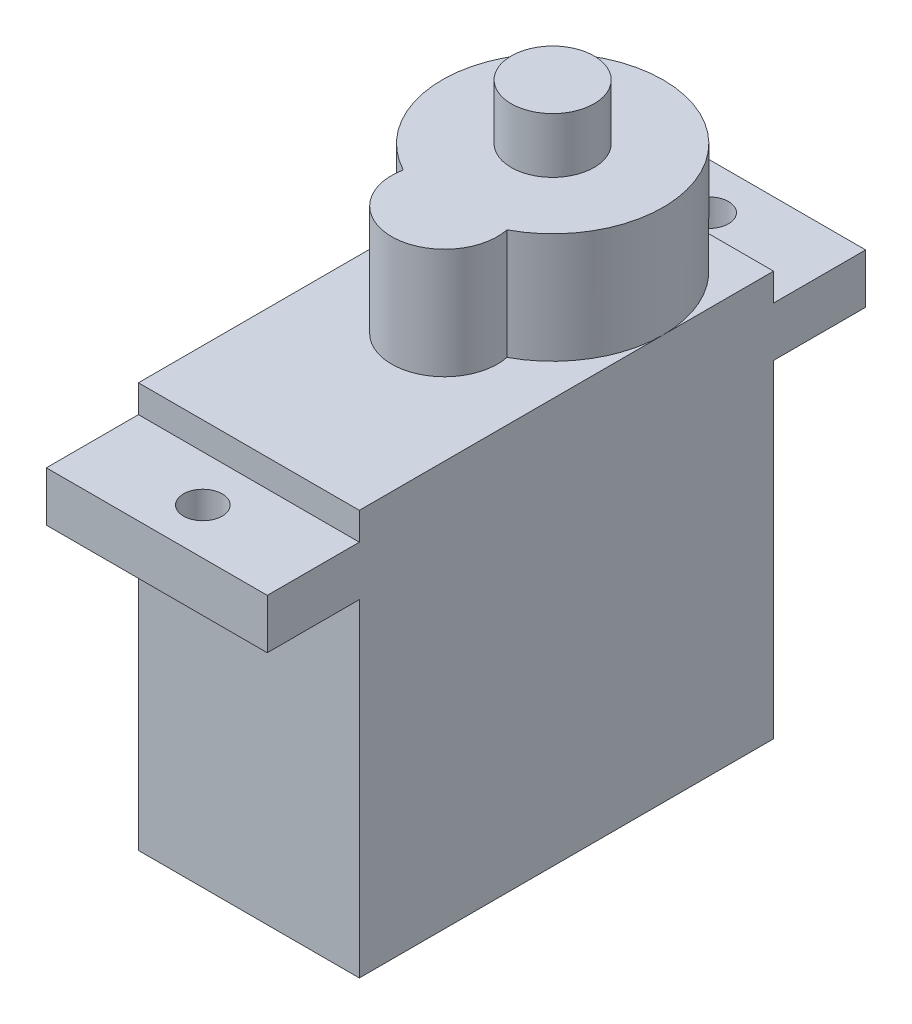
ISO-10303-21;
HEADER;
FILE_DESCRIPTION(('STEP AP214'),'2;1');
FILE_NAME('part.step','',(''),(''),'','','');
FILE_SCHEMA(('AUTOMOTIVE_DESIGN { 1 0 10303 214 1 1 1 1 }'));
ENDSEC;
DATA;
#1=APPLICATION_CONTEXT('core data for automotive mechanical design processes');
#2=APPLICATION_PROTOCOL_DEFINITION('international standard','automotive_design',2000,#1);
#3=PRODUCT_CONTEXT('',#1,'mechanical');
#4=PRODUCT('Part','Part','',(#3));
#5=PRODUCT_RELATED_PRODUCT_CATEGORY('part','',(#4));
#6=PRODUCT_DEFINITION_FORMATION('','',#4);
#7=PRODUCT_DEFINITION_CONTEXT('part definition',#1,'design');
#8=PRODUCT_DEFINITION('design','',#6,#7);
#9=PRODUCT_DEFINITION_SHAPE('','',#8);
#10=(LENGTH_UNIT() NAMED_UNIT(*) SI_UNIT(.MILLI.,.METRE.));
#11=(NAMED_UNIT(*) PLANE_ANGLE_UNIT() SI_UNIT($,.RADIAN.));
#12=(NAMED_UNIT(*) SI_UNIT($,.STERADIAN.) SOLID_ANGLE_UNIT());
#13=UNCERTAINTY_MEASURE_WITH_UNIT(LENGTH_MEASURE(1.E-05),#10,'distance_accuracy_value','');
#14=(GEOMETRIC_REPRESENTATION_CONTEXT(3) GLOBAL_UNCERTAINTY_ASSIGNED_CONTEXT((#13)) GLOBAL_UNIT_ASSIGNED_CONTEXT((#10,
#11,#12)) REPRESENTATION_CONTEXT('',''));
#15=CARTESIAN_POINT('',(0.,0.,0.));
#16=DIRECTION('',(0.,0.,1.));
#17=DIRECTION('',(1.,0.,0.));
#18=AXIS2_PLACEMENT_3D('',#15,#16,#17);
#19=CARTESIAN_POINT('',(12.,17.,-11.25));
#20=DIRECTION('',(0.,-1.,0.));
#21=DIRECTION('',(0.,0.,-1.));
#22=AXIS2_PLACEMENT_3D('',#19,#20,#21);
#23=PLANE('',#22);
#24=CARTESIAN_POINT('',(6.,17.,-5.25));
#25=DIRECTION('',(0.,1.,0.));
#26=DIRECTION('',(0.,0.,1.));
#27=AXIS2_PLACEMENT_3D('',#24,#25,#26);
#28=CIRCLE('',#27,2.25);
#29=CARTESIAN_POINT('',(6.,17.,-3.));
#30=VERTEX_POINT('',#29);
#31=EDGE_CURVE('E12',#30,#30,#28,.T.);
#32=ORIENTED_EDGE('',*,*,#31,.F.);
#33=EDGE_LOOP('',(#32));
#34=FACE_BOUND('',#33,.T.);
#35=CARTESIAN_POINT('',(6.,17.,-5.25));
#36=DIRECTION('',(0.,1.,0.));
#37=DIRECTION('',(0.,0.,1.));
#38=AXIS2_PLACEMENT_3D('',#35,#36,#37);
#39=CIRCLE('',#38,6.);
#40=CARTESIAN_POINT('',(8.81647806037152,17.,0.0478723404255359));
#41=VERTEX_POINT('',#40);
#42=CARTESIAN_POINT('',(3.18352193962849,17.,0.0478723404255359));
#43=VERTEX_POINT('',#42);
#44=EDGE_CURVE('E262',#41,#43,#39,.T.);
#45=ORIENTED_EDGE('',*,*,#44,.T.);
#46=CARTESIAN_POINT('',(6.,17.,0.625000000000002));
#47=DIRECTION('',(0.,1.,0.));
#48=DIRECTION('',(0.,0.,1.));
#49=AXIS2_PLACEMENT_3D('',#46,#47,#48);
#50=CIRCLE('',#49,2.875);
#51=EDGE_CURVE('E266',#43,#41,#50,.T.);
#52=ORIENTED_EDGE('',*,*,#51,.T.);
#53=EDGE_LOOP('',(#45,#52));
#54=FACE_BOUND('',#53,.T.);
#55=ADVANCED_FACE('F57',(#34,#54),#23,.F.);
#56=CARTESIAN_POINT('',(0.,0.,0.));
#57=DIRECTION('',(1.,0.,0.));
#58=DIRECTION('',(0.,0.,-1.));
#59=AXIS2_PLACEMENT_3D('',#56,#57,#58);
#60=PLANE('',#59);
#61=DIRECTION('',(0.,0.,-1.));
#62=VECTOR('',#61,1.);
#63=CARTESIAN_POINT('',(0.,11.,11.25));
#64=LINE('',#63,#62);
#65=CARTESIAN_POINT('',(0.,11.,11.25));
#66=VERTEX_POINT('',#65);
#67=CARTESIAN_POINT('',(0.,11.,-5.25));
#68=VERTEX_POINT('',#67);
#69=EDGE_CURVE('E207',#66,#68,#64,.T.);
#70=ORIENTED_EDGE('',*,*,#69,.T.);
#71=DIRECTION('',(0.,0.,1.));
#72=VECTOR('',#71,1.);
#73=CARTESIAN_POINT('',(0.,11.,0.));
#74=LINE('',#73,#72);
#75=CARTESIAN_POINT('',(0.,11.,-11.25));
#76=VERTEX_POINT('',#75);
#77=EDGE_CURVE('E222',#76,#68,#74,.T.);
#78=ORIENTED_EDGE('',*,*,#77,.F.);
#79=DIRECTION('',(0.,1.,0.));
#80=VECTOR('',#79,1.);
#81=CARTESIAN_POINT('',(0.,-11.,-11.25));
#82=LINE('',#81,#80);
#83=CARTESIAN_POINT('',(0.,9.5,-11.25));
#84=VERTEX_POINT('',#83);
#85=EDGE_CURVE('E237',#84,#76,#82,.T.);
#86=ORIENTED_EDGE('',*,*,#85,.F.);
#87=DIRECTION('',(0.,0.,-1.));
#88=VECTOR('',#87,1.);
#89=CARTESIAN_POINT('',(0.,9.5,-11.25));
#90=LINE('',#89,#88);
#91=CARTESIAN_POINT('',(0.,9.5,-16.25));
#92=VERTEX_POINT('',#91);
#93=EDGE_CURVE('E213',#84,#92,#90,.T.);
#94=ORIENTED_EDGE('',*,*,#93,.T.);
#95=DIRECTION('',(0.,-1.,0.));
#96=VECTOR('',#95,1.);
#97=CARTESIAN_POINT('',(0.,9.5,-16.25));
#98=LINE('',#97,#96);
#99=CARTESIAN_POINT('',(0.,6.8,-16.25));
#100=VERTEX_POINT('',#99);
#101=EDGE_CURVE('E221',#92,#100,#98,.T.);
#102=ORIENTED_EDGE('',*,*,#101,.T.);
#103=DIRECTION('',(0.,0.,-1.));
#104=VECTOR('',#103,1.);
#105=CARTESIAN_POINT('',(0.,6.8,-11.25));
#106=LINE('',#105,#104);
#107=CARTESIAN_POINT('',(0.,6.8,-11.25));
#108=VERTEX_POINT('',#107);
#109=EDGE_CURVE('E219',#108,#100,#106,.T.);
#110=ORIENTED_EDGE('',*,*,#109,.F.);
#111=CARTESIAN_POINT('',(0.,-11.,-11.25));
#112=VERTEX_POINT('',#111);
#113=EDGE_CURVE('E184',#112,#108,#82,.T.);
#114=ORIENTED_EDGE('',*,*,#113,.F.);
#115=DIRECTION('',(0.,0.,-1.));
#116=VECTOR('',#115,1.);
#117=CARTESIAN_POINT('',(0.,-11.,11.25));
#118=LINE('',#117,#116);
#119=CARTESIAN_POINT('',(0.,-11.,11.25));
#120=VERTEX_POINT('',#119);
#121=EDGE_CURVE('E180',#120,#112,#118,.T.);
#122=ORIENTED_EDGE('',*,*,#121,.F.);
#123=DIRECTION('',(0.,1.,0.));
#124=VECTOR('',#123,1.);
#125=CARTESIAN_POINT('',(0.,-11.,11.25));
#126=LINE('',#125,#124);
#127=CARTESIAN_POINT('',(0.,6.8,11.25));
#128=VERTEX_POINT('',#127);
#129=EDGE_CURVE('E179',#120,#128,#126,.T.);
#130=ORIENTED_EDGE('',*,*,#129,.T.);
#131=DIRECTION('',(0.,0.,1.));
#132=VECTOR('',#131,1.);
#133=CARTESIAN_POINT('',(0.,6.8,11.25));
#134=LINE('',#133,#132);
#135=CARTESIAN_POINT('',(0.,6.8,16.25));
#136=VERTEX_POINT('',#135);
#137=EDGE_CURVE('E202',#128,#136,#134,.T.);
#138=ORIENTED_EDGE('',*,*,#137,.T.);
#139=DIRECTION('',(0.,-1.,0.));
#140=VECTOR('',#139,1.);
#141=CARTESIAN_POINT('',(0.,9.5,16.25));
#142=LINE('',#141,#140);
#143=CARTESIAN_POINT('',(0.,9.5,16.25));
#144=VERTEX_POINT('',#143);
#145=EDGE_CURVE('E172',#144,#136,#142,.T.);
#146=ORIENTED_EDGE('',*,*,#145,.F.);
#147=DIRECTION('',(0.,0.,1.));
#148=VECTOR('',#147,1.);
#149=CARTESIAN_POINT('',(0.,9.5,11.25));
#150=LINE('',#149,#148);
#151=CARTESIAN_POINT('',(0.,9.5,11.25));
#152=VERTEX_POINT('',#151);
#153=EDGE_CURVE('E158',#152,#144,#150,.T.);
#154=ORIENTED_EDGE('',*,*,#153,.F.);
#155=EDGE_CURVE('E168',#152,#66,#126,.T.);
#156=ORIENTED_EDGE('',*,*,#155,.T.);
#157=EDGE_LOOP('',(#70,#78,#86,#94,#102,#110,#114,#122,#130,#138,#146,#154,#156));
#158=FACE_BOUND('',#157,.T.);
#159=ADVANCED_FACE('F167',(#158),#60,.F.);
#160=CARTESIAN_POINT('',(12.,0.,0.));
#161=DIRECTION('',(1.,0.,0.));
#162=DIRECTION('',(0.,0.,-1.));
#163=AXIS2_PLACEMENT_3D('',#160,#161,#162);
#164=PLANE('',#163);
#165=DIRECTION('',(0.,1.,0.));
#166=VECTOR('',#165,1.);
#167=CARTESIAN_POINT('',(12.,-11.,-11.25));
#168=LINE('',#167,#166);
#169=CARTESIAN_POINT('',(12.,9.5,-11.25));
#170=VERTEX_POINT('',#169);
#171=CARTESIAN_POINT('',(12.,11.,-11.25));
#172=VERTEX_POINT('',#171);
#173=EDGE_CURVE('E250',#170,#172,#168,.T.);
#174=ORIENTED_EDGE('',*,*,#173,.T.);
#175=DIRECTION('',(0.,0.,-1.));
#176=VECTOR('',#175,1.);
#177=CARTESIAN_POINT('',(12.,11.,0.));
#178=LINE('',#177,#176);
#179=CARTESIAN_POINT('',(12.,11.,-5.25));
#180=VERTEX_POINT('',#179);
#181=EDGE_CURVE('E275',#180,#172,#178,.T.);
#182=ORIENTED_EDGE('',*,*,#181,.F.);
#183=DIRECTION('',(0.,0.,-1.));
#184=VECTOR('',#183,1.);
#185=CARTESIAN_POINT('',(12.,11.,11.25));
#186=LINE('',#185,#184);
#187=CARTESIAN_POINT('',(12.,11.,11.25));
#188=VERTEX_POINT('',#187);
#189=EDGE_CURVE('E183',#188,#180,#186,.T.);
#190=ORIENTED_EDGE('',*,*,#189,.F.);
#191=DIRECTION('',(0.,1.,0.));
#192=VECTOR('',#191,1.);
#193=CARTESIAN_POINT('',(12.,-11.,11.25));
#194=LINE('',#193,#192);
#195=CARTESIAN_POINT('',(12.,9.5,11.25));
#196=VERTEX_POINT('',#195);
#197=EDGE_CURVE('E244',#196,#188,#194,.T.);
#198=ORIENTED_EDGE('',*,*,#197,.F.);
#199=DIRECTION('',(0.,0.,1.));
#200=VECTOR('',#199,1.);
#201=CARTESIAN_POINT('',(12.,9.5,11.25));
#202=LINE('',#201,#200);
#203=CARTESIAN_POINT('',(12.,9.5,16.25));
#204=VERTEX_POINT('',#203);
#205=EDGE_CURVE('E160',#196,#204,#202,.T.);
#206=ORIENTED_EDGE('',*,*,#205,.T.);
#207=DIRECTION('',(0.,-1.,0.));
#208=VECTOR('',#207,1.);
#209=CARTESIAN_POINT('',(12.,9.5,16.25));
#210=LINE('',#209,#208);
#211=CARTESIAN_POINT('',(12.,6.8,16.25));
#212=VERTEX_POINT('',#211);
#213=EDGE_CURVE('E198',#204,#212,#210,.T.);
#214=ORIENTED_EDGE('',*,*,#213,.T.);
#215=DIRECTION('',(0.,0.,1.));
#216=VECTOR('',#215,1.);
#217=CARTESIAN_POINT('',(12.,6.8,11.25));
#218=LINE('',#217,#216);
#219=CARTESIAN_POINT('',(12.,6.8,11.25));
#220=VERTEX_POINT('',#219);
#221=EDGE_CURVE('E173',#220,#212,#218,.T.);
#222=ORIENTED_EDGE('',*,*,#221,.F.);
#223=CARTESIAN_POINT('',(12.,-11.,11.25));
#224=VERTEX_POINT('',#223);
#225=EDGE_CURVE('E195',#224,#220,#194,.T.);
#226=ORIENTED_EDGE('',*,*,#225,.F.);
#227=DIRECTION('',(0.,0.,-1.));
#228=VECTOR('',#227,1.);
#229=CARTESIAN_POINT('',(12.,-11.,11.25));
#230=LINE('',#229,#228);
#231=CARTESIAN_POINT('',(12.,-11.,-11.25));
#232=VERTEX_POINT('',#231);
#233=EDGE_CURVE('E245',#224,#232,#230,.T.);
#234=ORIENTED_EDGE('',*,*,#233,.T.);
#235=CARTESIAN_POINT('',(12.,6.8,-11.25));
#236=VERTEX_POINT('',#235);
#237=EDGE_CURVE('E247',#232,#236,#168,.T.);
#238=ORIENTED_EDGE('',*,*,#237,.T.);
#239=DIRECTION('',(0.,0.,-1.));
#240=VECTOR('',#239,1.);
#241=CARTESIAN_POINT('',(12.,6.8,-11.25));
#242=LINE('',#241,#240);
#243=CARTESIAN_POINT('',(12.,6.8,-16.25));
#244=VERTEX_POINT('',#243);
#245=EDGE_CURVE('E210',#236,#244,#242,.T.);
#246=ORIENTED_EDGE('',*,*,#245,.T.);
#247=DIRECTION('',(0.,-1.,0.));
#248=VECTOR('',#247,1.);
#249=CARTESIAN_POINT('',(12.,9.5,-16.25));
#250=LINE('',#249,#248);
#251=CARTESIAN_POINT('',(12.,9.5,-16.25));
#252=VERTEX_POINT('',#251);
#253=EDGE_CURVE('E212',#252,#244,#250,.T.);
#254=ORIENTED_EDGE('',*,*,#253,.F.);
#255=DIRECTION('',(0.,0.,-1.));
#256=VECTOR('',#255,1.);
#257=CARTESIAN_POINT('',(12.,9.5,-11.25));
#258=LINE('',#257,#256);
#259=EDGE_CURVE('E215',#170,#252,#258,.T.);
#260=ORIENTED_EDGE('',*,*,#259,.F.);
#261=EDGE_LOOP('',(#174,#182,#190,#198,#206,#214,#222,#226,#234,#238,#246,#254,#260));
#262=FACE_BOUND('',#261,.T.);
#263=ADVANCED_FACE('F350',(#262),#164,.T.);
#264=CARTESIAN_POINT('',(12.,-11.,-11.25));
#265=DIRECTION('',(0.,0.,1.));
#266=DIRECTION('',(1.,0.,0.));
#267=AXIS2_PLACEMENT_3D('',#264,#265,#266);
#268=PLANE('',#267);
#269=DIRECTION('',(-1.,0.,0.));
#270=VECTOR('',#269,1.);
#271=CARTESIAN_POINT('',(0.,11.,-11.25));
#272=LINE('',#271,#270);
#273=CARTESIAN_POINT('',(6.,11.,-11.25));
#274=VERTEX_POINT('',#273);
#275=EDGE_CURVE('E269',#172,#274,#272,.T.);
#276=ORIENTED_EDGE('',*,*,#275,.F.);
#277=ORIENTED_EDGE('',*,*,#173,.F.);
#278=DIRECTION('',(-1.,0.,0.));
#279=VECTOR('',#278,1.);
#280=CARTESIAN_POINT('',(12.,9.5,-11.25));
#281=LINE('',#280,#279);
#282=EDGE_CURVE('E189',#170,#84,#281,.T.);
#283=ORIENTED_EDGE('',*,*,#282,.T.);
#284=ORIENTED_EDGE('',*,*,#85,.T.);
#285=DIRECTION('',(-1.,0.,0.));
#286=VECTOR('',#285,1.);
#287=CARTESIAN_POINT('',(0.,11.,-11.25));
#288=LINE('',#287,#286);
#289=EDGE_CURVE('E117',#274,#76,#288,.T.);
#290=ORIENTED_EDGE('',*,*,#289,.F.);
#291=EDGE_LOOP('',(#276,#277,#283,#284,#290));
#292=FACE_BOUND('',#291,.T.);
#293=ADVANCED_FACE('F346',(#292),#268,.F.);
#294=CARTESIAN_POINT('',(12.,11.,11.25));
#295=DIRECTION('',(0.,1.,0.));
#296=DIRECTION('',(0.,0.,1.));
#297=AXIS2_PLACEMENT_3D('',#294,#295,#296);
#298=PLANE('',#297);
#299=ORIENTED_EDGE('',*,*,#189,.T.);
#300=CARTESIAN_POINT('',(6.,11.,-5.25));
#301=DIRECTION('',(0.,1.,0.));
#302=DIRECTION('',(0.,0.,1.));
#303=AXIS2_PLACEMENT_3D('',#300,#301,#302);
#304=CIRCLE('',#303,6.);
#305=CARTESIAN_POINT('',(8.81647806037152,11.,0.0478723404255359));
#306=VERTEX_POINT('',#305);
#307=EDGE_CURVE('E261',#306,#180,#304,.T.);
#308=ORIENTED_EDGE('',*,*,#307,.F.);
#309=CARTESIAN_POINT('',(6.,11.,0.625000000000002));
#310=DIRECTION('',(0.,1.,0.));
#311=DIRECTION('',(0.,0.,1.));
#312=AXIS2_PLACEMENT_3D('',#309,#310,#311);
#313=CIRCLE('',#312,2.875);
#314=CARTESIAN_POINT('',(3.18352193962849,11.,0.0478723404255359));
#315=VERTEX_POINT('',#314);
#316=EDGE_CURVE('E265',#315,#306,#313,.T.);
#317=ORIENTED_EDGE('',*,*,#316,.F.);
#318=CARTESIAN_POINT('',(6.,11.,-5.25));
#319=DIRECTION('',(0.,1.,0.));
#320=DIRECTION('',(0.,0.,1.));
#321=AXIS2_PLACEMENT_3D('',#318,#319,#320);
#322=CIRCLE('',#321,6.);
#323=EDGE_CURVE('E284',#68,#315,#322,.T.);
#324=ORIENTED_EDGE('',*,*,#323,.F.);
#325=ORIENTED_EDGE('',*,*,#69,.F.);
#326=DIRECTION('',(-1.,0.,0.));
#327=VECTOR('',#326,1.);
#328=CARTESIAN_POINT('',(12.,11.,11.25));
#329=LINE('',#328,#327);
#330=EDGE_CURVE('E177',#188,#66,#329,.T.);
#331=ORIENTED_EDGE('',*,*,#330,.F.);
#332=EDGE_LOOP('',(#299,#308,#317,#324,#325,#331));
#333=FACE_BOUND('',#332,.T.);
#334=ADVANCED_FACE('F340',(#333),#298,.T.);
#335=CARTESIAN_POINT('',(12.,-11.,11.25));
#336=DIRECTION('',(0.,1.,0.));
#337=DIRECTION('',(0.,0.,1.));
#338=AXIS2_PLACEMENT_3D('',#335,#336,#337);
#339=PLANE('',#338);
#340=ORIENTED_EDGE('',*,*,#121,.T.);
#341=DIRECTION('',(-1.,0.,0.));
#342=VECTOR('',#341,1.);
#343=CARTESIAN_POINT('',(12.,-11.,-11.25));
#344=LINE('',#343,#342);
#345=EDGE_CURVE('E192',#232,#112,#344,.T.);
#346=ORIENTED_EDGE('',*,*,#345,.F.);
#347=ORIENTED_EDGE('',*,*,#233,.F.);
#348=DIRECTION('',(-1.,0.,0.));
#349=VECTOR('',#348,1.);
#350=CARTESIAN_POINT('',(12.,-11.,11.25));
#351=LINE('',#350,#349);
#352=EDGE_CURVE('E190',#224,#120,#351,.T.);
#353=ORIENTED_EDGE('',*,*,#352,.T.);
#354=EDGE_LOOP('',(#340,#346,#347,#353));
#355=FACE_BOUND('',#354,.T.);
#356=ADVANCED_FACE('F361',(#355),#339,.F.);
#357=DIRECTION('',(-1.,0.,0.));
#358=VECTOR('',#357,1.);
#359=CARTESIAN_POINT('',(12.,6.8,-11.25));
#360=LINE('',#359,#358);
#361=EDGE_CURVE('E61',#236,#108,#360,.T.);
#362=ORIENTED_EDGE('',*,*,#361,.F.);
#363=ORIENTED_EDGE('',*,*,#237,.F.);
#364=ORIENTED_EDGE('',*,*,#345,.T.);
#365=ORIENTED_EDGE('',*,*,#113,.T.);
#366=EDGE_LOOP('',(#362,#363,#364,#365));
#367=FACE_BOUND('',#366,.T.);
#368=ADVANCED_FACE('F357',(#367),#268,.F.);
#369=CARTESIAN_POINT('',(12.,-11.,11.25));
#370=DIRECTION('',(0.,0.,1.));
#371=DIRECTION('',(1.,0.,0.));
#372=AXIS2_PLACEMENT_3D('',#369,#370,#371);
#373=PLANE('',#372);
#374=ORIENTED_EDGE('',*,*,#225,.T.);
#375=DIRECTION('',(-1.,0.,0.));
#376=VECTOR('',#375,1.);
#377=CARTESIAN_POINT('',(12.,6.8,11.25));
#378=LINE('',#377,#376);
#379=EDGE_CURVE('E162',#220,#128,#378,.T.);
#380=ORIENTED_EDGE('',*,*,#379,.T.);
#381=ORIENTED_EDGE('',*,*,#129,.F.);
#382=ORIENTED_EDGE('',*,*,#352,.F.);
#383=EDGE_LOOP('',(#374,#380,#381,#382));
#384=FACE_BOUND('',#383,.T.);
#385=ADVANCED_FACE('F365',(#384),#373,.T.);
#386=DIRECTION('',(-1.,0.,0.));
#387=VECTOR('',#386,1.);
#388=CARTESIAN_POINT('',(12.,9.5,11.25));
#389=LINE('',#388,#387);
#390=EDGE_CURVE('E67',#196,#152,#389,.T.);
#391=ORIENTED_EDGE('',*,*,#390,.F.);
#392=ORIENTED_EDGE('',*,*,#197,.T.);
#393=ORIENTED_EDGE('',*,*,#330,.T.);
#394=ORIENTED_EDGE('',*,*,#155,.F.);
#395=EDGE_LOOP('',(#391,#392,#393,#394));
#396=FACE_BOUND('',#395,.T.);
#397=ADVANCED_FACE('F175',(#396),#373,.T.);
#398=CARTESIAN_POINT('',(12.,9.5,-16.25));
#399=DIRECTION('',(0.,0.,-1.));
#400=DIRECTION('',(0.,1.,0.));
#401=AXIS2_PLACEMENT_3D('',#398,#399,#400);
#402=PLANE('',#401);
#403=ORIENTED_EDGE('',*,*,#101,.F.);
#404=DIRECTION('',(-1.,0.,0.));
#405=VECTOR('',#404,1.);
#406=CARTESIAN_POINT('',(12.,9.5,-16.25));
#407=LINE('',#406,#405);
#408=EDGE_CURVE('E218',#252,#92,#407,.T.);
#409=ORIENTED_EDGE('',*,*,#408,.F.);
#410=ORIENTED_EDGE('',*,*,#253,.T.);
#411=DIRECTION('',(-1.,0.,0.));
#412=VECTOR('',#411,1.);
#413=CARTESIAN_POINT('',(12.,6.8,-16.25));
#414=LINE('',#413,#412);
#415=EDGE_CURVE('E107',#244,#100,#414,.T.);
#416=ORIENTED_EDGE('',*,*,#415,.T.);
#417=EDGE_LOOP('',(#403,#409,#410,#416));
#418=FACE_BOUND('',#417,.T.);
#419=ADVANCED_FACE('F234',(#418),#402,.T.);
#420=CARTESIAN_POINT('',(12.,9.5,-11.25));
#421=DIRECTION('',(0.,1.,0.));
#422=DIRECTION('',(0.,0.,1.));
#423=AXIS2_PLACEMENT_3D('',#420,#421,#422);
#424=PLANE('',#423);
#425=CARTESIAN_POINT('',(6.,9.5,-13.75));
#426=DIRECTION('',(0.,1.,0.));
#427=DIRECTION('',(0.,0.,1.));
#428=AXIS2_PLACEMENT_3D('',#425,#426,#427);
#429=CIRCLE('',#428,1.05);
#430=CARTESIAN_POINT('',(6.,9.5,-12.7));
#431=VERTEX_POINT('',#430);
#432=EDGE_CURVE('E295',#431,#431,#429,.T.);
#433=ORIENTED_EDGE('',*,*,#432,.F.);
#434=EDGE_LOOP('',(#433));
#435=FACE_BOUND('',#434,.T.);
#436=ORIENTED_EDGE('',*,*,#93,.F.);
#437=ORIENTED_EDGE('',*,*,#282,.F.);
#438=ORIENTED_EDGE('',*,*,#259,.T.);
#439=ORIENTED_EDGE('',*,*,#408,.T.);
#440=EDGE_LOOP('',(#436,#437,#438,#439));
#441=FACE_BOUND('',#440,.T.);
#442=ADVANCED_FACE('F230',(#435,#441),#424,.T.);
#443=CARTESIAN_POINT('',(12.,6.8,-11.25));
#444=DIRECTION('',(0.,1.,0.));
#445=DIRECTION('',(0.,0.,1.));
#446=AXIS2_PLACEMENT_3D('',#443,#444,#445);
#447=PLANE('',#446);
#448=CARTESIAN_POINT('',(6.,6.8,-13.75));
#449=DIRECTION('',(0.,1.,0.));
#450=DIRECTION('',(0.,0.,1.));
#451=AXIS2_PLACEMENT_3D('',#448,#449,#450);
#452=CIRCLE('',#451,1.05);
#453=CARTESIAN_POINT('',(6.,6.8,-12.7));
#454=VERTEX_POINT('',#453);
#455=EDGE_CURVE('E287',#454,#454,#452,.T.);
#456=ORIENTED_EDGE('',*,*,#455,.T.);
#457=EDGE_LOOP('',(#456));
#458=FACE_BOUND('',#457,.T.);
#459=ORIENTED_EDGE('',*,*,#109,.T.);
#460=ORIENTED_EDGE('',*,*,#415,.F.);
#461=ORIENTED_EDGE('',*,*,#245,.F.);
#462=ORIENTED_EDGE('',*,*,#361,.T.);
#463=EDGE_LOOP('',(#459,#460,#461,#462));
#464=FACE_BOUND('',#463,.T.);
#465=ADVANCED_FACE('F59',(#458,#464),#447,.F.);
#466=CARTESIAN_POINT('',(12.,9.5,16.25));
#467=DIRECTION('',(0.,0.,-1.));
#468=DIRECTION('',(0.,1.,0.));
#469=AXIS2_PLACEMENT_3D('',#466,#467,#468);
#470=PLANE('',#469);
#471=ORIENTED_EDGE('',*,*,#145,.T.);
#472=DIRECTION('',(-1.,0.,0.));
#473=VECTOR('',#472,1.);
#474=CARTESIAN_POINT('',(12.,6.8,16.25));
#475=LINE('',#474,#473);
#476=EDGE_CURVE('E201',#212,#136,#475,.T.);
#477=ORIENTED_EDGE('',*,*,#476,.F.);
#478=ORIENTED_EDGE('',*,*,#213,.F.);
#479=DIRECTION('',(-1.,0.,0.));
#480=VECTOR('',#479,1.);
#481=CARTESIAN_POINT('',(12.,9.5,16.25));
#482=LINE('',#481,#480);
#483=EDGE_CURVE('E205',#204,#144,#482,.T.);
#484=ORIENTED_EDGE('',*,*,#483,.T.);
#485=EDGE_LOOP('',(#471,#477,#478,#484));
#486=FACE_BOUND('',#485,.T.);
#487=ADVANCED_FACE('F373',(#486),#470,.F.);
#488=CARTESIAN_POINT('',(12.,6.8,11.25));
#489=DIRECTION('',(0.,-1.,0.));
#490=DIRECTION('',(0.,0.,-1.));
#491=AXIS2_PLACEMENT_3D('',#488,#489,#490);
#492=PLANE('',#491);
#493=CARTESIAN_POINT('',(6.,6.8,13.75));
#494=DIRECTION('',(0.,1.,0.));
#495=DIRECTION('',(0.,0.,1.));
#496=AXIS2_PLACEMENT_3D('',#493,#494,#495);
#497=CIRCLE('',#496,1.05);
#498=CARTESIAN_POINT('',(6.,6.8,14.8));
#499=VERTEX_POINT('',#498);
#500=EDGE_CURVE('E288',#499,#499,#497,.T.);
#501=ORIENTED_EDGE('',*,*,#500,.T.);
#502=EDGE_LOOP('',(#501));
#503=FACE_BOUND('',#502,.T.);
#504=ORIENTED_EDGE('',*,*,#137,.F.);
#505=ORIENTED_EDGE('',*,*,#379,.F.);
#506=ORIENTED_EDGE('',*,*,#221,.T.);
#507=ORIENTED_EDGE('',*,*,#476,.T.);
#508=EDGE_LOOP('',(#504,#505,#506,#507));
#509=FACE_BOUND('',#508,.T.);
#510=ADVANCED_FACE('F369',(#503,#509),#492,.T.);
#511=CARTESIAN_POINT('',(12.,9.5,11.25));
#512=DIRECTION('',(0.,-1.,0.));
#513=DIRECTION('',(0.,0.,-1.));
#514=AXIS2_PLACEMENT_3D('',#511,#512,#513);
#515=PLANE('',#514);
#516=CARTESIAN_POINT('',(6.,9.5,13.75));
#517=DIRECTION('',(0.,1.,0.));
#518=DIRECTION('',(0.,0.,1.));
#519=AXIS2_PLACEMENT_3D('',#516,#517,#518);
#520=CIRCLE('',#519,1.05);
#521=CARTESIAN_POINT('',(6.,9.5,14.8));
#522=VERTEX_POINT('',#521);
#523=EDGE_CURVE('E291',#522,#522,#520,.T.);
#524=ORIENTED_EDGE('',*,*,#523,.F.);
#525=EDGE_LOOP('',(#524));
#526=FACE_BOUND('',#525,.T.);
#527=ORIENTED_EDGE('',*,*,#153,.T.);
#528=ORIENTED_EDGE('',*,*,#483,.F.);
#529=ORIENTED_EDGE('',*,*,#205,.F.);
#530=ORIENTED_EDGE('',*,*,#390,.T.);
#531=EDGE_LOOP('',(#527,#528,#529,#530));
#532=FACE_BOUND('',#531,.T.);
#533=ADVANCED_FACE('F156',(#526,#532),#515,.F.);
#534=CARTESIAN_POINT('',(6.,11.,0.625000000000002));
#535=DIRECTION('',(0.,1.,0.));
#536=DIRECTION('',(0.,0.,1.));
#537=AXIS2_PLACEMENT_3D('',#534,#535,#536);
#538=CYLINDRICAL_SURFACE('',#537,2.875);
#539=ORIENTED_EDGE('',*,*,#51,.F.);
#540=DIRECTION('',(0.,1.,0.));
#541=VECTOR('',#540,1.);
#542=CARTESIAN_POINT('',(3.18352193962849,11.,0.0478723404255359));
#543=LINE('',#542,#541);
#544=EDGE_CURVE('E281',#315,#43,#543,.T.);
#545=ORIENTED_EDGE('',*,*,#544,.F.);
#546=ORIENTED_EDGE('',*,*,#316,.T.);
#547=DIRECTION('',(0.,1.,0.));
#548=VECTOR('',#547,1.);
#549=CARTESIAN_POINT('',(8.81647806037152,11.,0.0478723404255359));
#550=LINE('',#549,#548);
#551=EDGE_CURVE('E258',#306,#41,#550,.T.);
#552=ORIENTED_EDGE('',*,*,#551,.T.);
#553=EDGE_LOOP('',(#539,#545,#546,#552));
#554=FACE_BOUND('',#553,.T.);
#555=ADVANCED_FACE('F327',(#554),#538,.T.);
#556=CARTESIAN_POINT('',(6.,11.,-5.25));
#557=DIRECTION('',(0.,1.,0.));
#558=DIRECTION('',(0.,0.,1.));
#559=AXIS2_PLACEMENT_3D('',#556,#557,#558);
#560=CYLINDRICAL_SURFACE('',#559,6.);
#561=ORIENTED_EDGE('',*,*,#44,.F.);
#562=ORIENTED_EDGE('',*,*,#551,.F.);
#563=ORIENTED_EDGE('',*,*,#307,.T.);
#564=CARTESIAN_POINT('',(6.,11.,-5.25));
#565=DIRECTION('',(0.,1.,0.));
#566=DIRECTION('',(0.,0.,1.));
#567=AXIS2_PLACEMENT_3D('',#564,#565,#566);
#568=CIRCLE('',#567,6.);
#569=EDGE_CURVE('E278',#180,#274,#568,.T.);
#570=ORIENTED_EDGE('',*,*,#569,.T.);
#571=CARTESIAN_POINT('',(6.,11.,-5.25));
#572=DIRECTION('',(0.,1.,0.));
#573=DIRECTION('',(0.,0.,1.));
#574=AXIS2_PLACEMENT_3D('',#571,#572,#573);
#575=CIRCLE('',#574,6.);
#576=EDGE_CURVE('E255',#274,#68,#575,.T.);
#577=ORIENTED_EDGE('',*,*,#576,.T.);
#578=ORIENTED_EDGE('',*,*,#323,.T.);
#579=ORIENTED_EDGE('',*,*,#544,.T.);
#580=EDGE_LOOP('',(#561,#562,#563,#570,#577,#578,#579));
#581=FACE_BOUND('',#580,.T.);
#582=ADVANCED_FACE('F324',(#581),#560,.T.);
#583=CARTESIAN_POINT('',(0.,11.,0.));
#584=DIRECTION('',(0.,1.,0.));
#585=DIRECTION('',(0.,0.,1.));
#586=AXIS2_PLACEMENT_3D('',#583,#584,#585);
#587=PLANE('',#586);
#588=ORIENTED_EDGE('',*,*,#576,.F.);
#589=ORIENTED_EDGE('',*,*,#289,.T.);
#590=ORIENTED_EDGE('',*,*,#77,.T.);
#591=EDGE_LOOP('',(#588,#589,#590));
#592=FACE_BOUND('',#591,.T.);
#593=ADVANCED_FACE('F344',(#592),#587,.T.);
#594=CARTESIAN_POINT('',(0.,11.,0.));
#595=DIRECTION('',(0.,1.,0.));
#596=DIRECTION('',(0.,0.,1.));
#597=AXIS2_PLACEMENT_3D('',#594,#595,#596);
#598=PLANE('',#597);
#599=ORIENTED_EDGE('',*,*,#569,.F.);
#600=ORIENTED_EDGE('',*,*,#181,.T.);
#601=ORIENTED_EDGE('',*,*,#275,.T.);
#602=EDGE_LOOP('',(#599,#600,#601));
#603=FACE_BOUND('',#602,.T.);
#604=ADVANCED_FACE('F406',(#603),#598,.T.);
#605=CARTESIAN_POINT('',(6.,6.8,13.75));
#606=DIRECTION('',(0.,1.,0.));
#607=DIRECTION('',(0.,0.,1.));
#608=AXIS2_PLACEMENT_3D('',#605,#606,#607);
#609=CYLINDRICAL_SURFACE('',#608,1.05);
#610=CARTESIAN_POINT('',(6.,6.8,14.8));
#611=CARTESIAN_POINT('',(6.,6.828125,14.8));
#612=CARTESIAN_POINT('',(6.,6.85625,14.8));
#613=CARTESIAN_POINT('',(6.,6.9125,14.8));
#614=CARTESIAN_POINT('',(6.,6.940625,14.8));
#615=CARTESIAN_POINT('',(6.,6.996875,14.8));
#616=CARTESIAN_POINT('',(6.,7.025,14.8));
#617=CARTESIAN_POINT('',(6.,7.08125,14.8));
#618=CARTESIAN_POINT('',(6.,7.109375,14.8));
#619=CARTESIAN_POINT('',(6.,7.165625,14.8));
#620=CARTESIAN_POINT('',(6.,7.19375,14.8));
#621=CARTESIAN_POINT('',(6.,7.25,14.8));
#622=CARTESIAN_POINT('',(6.,7.278125,14.8));
#623=CARTESIAN_POINT('',(6.,7.334375,14.8));
#624=CARTESIAN_POINT('',(6.,7.3625,14.8));
#625=CARTESIAN_POINT('',(6.,7.41875,14.8));
#626=CARTESIAN_POINT('',(6.,7.446875,14.8));
#627=CARTESIAN_POINT('',(6.,7.503125,14.8));
#628=CARTESIAN_POINT('',(6.,7.53125,14.8));
#629=CARTESIAN_POINT('',(6.,7.5875,14.8));
#630=CARTESIAN_POINT('',(6.,7.615625,14.8));
#631=CARTESIAN_POINT('',(6.,7.671875,14.8));
#632=CARTESIAN_POINT('',(6.,7.7,14.8));
#633=CARTESIAN_POINT('',(6.,7.75625,14.8));
#634=CARTESIAN_POINT('',(6.,7.784375,14.8));
#635=CARTESIAN_POINT('',(6.,7.840625,14.8));
#636=CARTESIAN_POINT('',(6.,7.86875,14.8));
#637=CARTESIAN_POINT('',(6.,7.925,14.8));
#638=CARTESIAN_POINT('',(6.,7.953125,14.8));
#639=CARTESIAN_POINT('',(6.,8.009375,14.8));
#640=CARTESIAN_POINT('',(6.,8.0375,14.8));
#641=CARTESIAN_POINT('',(6.,8.09375,14.8));
#642=CARTESIAN_POINT('',(6.,8.121875,14.8));
#643=CARTESIAN_POINT('',(6.,8.178125,14.8));
#644=CARTESIAN_POINT('',(6.,8.20625,14.8));
#645=CARTESIAN_POINT('',(6.,8.2625,14.8));
#646=CARTESIAN_POINT('',(6.,8.290625,14.8));
#647=CARTESIAN_POINT('',(6.,8.346875,14.8));
#648=CARTESIAN_POINT('',(6.,8.375,14.8));
#649=CARTESIAN_POINT('',(6.,8.43125,14.8));
#650=CARTESIAN_POINT('',(6.,8.459375,14.8));
#651=CARTESIAN_POINT('',(6.,8.515625,14.8));
#652=CARTESIAN_POINT('',(6.,8.54375,14.8));
#653=CARTESIAN_POINT('',(6.,8.6,14.8));
#654=CARTESIAN_POINT('',(6.,8.628125,14.8));
#655=CARTESIAN_POINT('',(6.,8.684375,14.8));
#656=CARTESIAN_POINT('',(6.,8.7125,14.8));
#657=CARTESIAN_POINT('',(6.,8.76875,14.8));
#658=CARTESIAN_POINT('',(6.,8.796875,14.8));
#659=CARTESIAN_POINT('',(6.,8.853125,14.8));
#660=CARTESIAN_POINT('',(6.,8.88125,14.8));
#661=CARTESIAN_POINT('',(6.,8.9375,14.8));
#662=CARTESIAN_POINT('',(6.,8.965625,14.8));
#663=CARTESIAN_POINT('',(6.,9.021875,14.8));
#664=CARTESIAN_POINT('',(6.,9.05,14.8));
#665=CARTESIAN_POINT('',(6.,9.10625,14.8));
#666=CARTESIAN_POINT('',(6.,9.134375,14.8));
#667=CARTESIAN_POINT('',(6.,9.190625,14.8));
#668=CARTESIAN_POINT('',(6.,9.21875,14.8));
#669=CARTESIAN_POINT('',(6.,9.275,14.8));
#670=CARTESIAN_POINT('',(6.,9.303125,14.8));
#671=CARTESIAN_POINT('',(6.,9.359375,14.8));
#672=CARTESIAN_POINT('',(6.,9.3875,14.8));
#673=CARTESIAN_POINT('',(6.,9.44375,14.8));
#674=CARTESIAN_POINT('',(6.,9.471875,14.8));
#675=CARTESIAN_POINT('',(6.,9.5,14.8));
#676=B_SPLINE_CURVE_WITH_KNOTS('',3,(#610,#611,#612,#613,#614,#615,#616,#617,#618,#619,#620,
#621,#622,#623,#624,#625,#626,#627,#628,#629,#630,#631,#632,#633,#634,#635,#636,#637,#638,#639,
#640,#641,#642,#643,#644,#645,#646,#647,#648,#649,#650,#651,#652,#653,#654,#655,#656,#657,#658,
#659,#660,#661,#662,#663,#664,#665,#666,#667,#668,#669,#670,#671,#672,#673,#674,#675),
.UNSPECIFIED.,.F.,.F.,(4,2,2,2,2,2,2,2,2,2,2,2,2,2,2,2,2,2,2,2,2,2,2,2,2,2,2,2,2,2,2,2,4),(0.,
0.0843749999999994,0.16875,0.253125,0.337499999999999,0.421875,0.50625,0.590625,
0.674999999999999,0.759375,0.84375,0.928124999999999,1.0125,1.096875,1.18125,1.265625,1.35,
1.434375,1.51875,1.603125,1.6875,1.771875,1.85625,1.940625,2.025,2.109375,2.19375,2.278125,
2.3625,2.446875,2.53125,2.615625,2.7),.UNSPECIFIED.);
#677=EDGE_CURVE('BSEAM400',#499,#522,#676,.T.);
#678=ORIENTED_EDGE('',*,*,#500,.F.);
#679=ORIENTED_EDGE('',*,*,#523,.T.);
#680=ORIENTED_EDGE('',*,*,#677,.T.);
#681=ORIENTED_EDGE('',*,*,#677,.F.);
#682=EDGE_LOOP('',(#678,#680,#679,#681));
#683=FACE_BOUND('',#682,.T.);
#684=ADVANCED_FACE('F400',(#683),#609,.F.);
#685=CARTESIAN_POINT('',(6.,6.8,-13.75));
#686=DIRECTION('',(0.,1.,0.));
#687=DIRECTION('',(0.,0.,1.));
#688=AXIS2_PLACEMENT_3D('',#685,#686,#687);
#689=CYLINDRICAL_SURFACE('',#688,1.05);
#690=CARTESIAN_POINT('',(6.,6.8,-12.7));
#691=CARTESIAN_POINT('',(6.,6.828125,-12.7));
#692=CARTESIAN_POINT('',(6.,6.85625,-12.7));
#693=CARTESIAN_POINT('',(6.,6.9125,-12.7));
#694=CARTESIAN_POINT('',(6.,6.940625,-12.7));
#695=CARTESIAN_POINT('',(6.,6.996875,-12.7));
#696=CARTESIAN_POINT('',(6.,7.025,-12.7));
#697=CARTESIAN_POINT('',(6.,7.08125,-12.7));
#698=CARTESIAN_POINT('',(6.,7.109375,-12.7));
#699=CARTESIAN_POINT('',(6.,7.165625,-12.7));
#700=CARTESIAN_POINT('',(6.,7.19375,-12.7));
#701=CARTESIAN_POINT('',(6.,7.25,-12.7));
#702=CARTESIAN_POINT('',(6.,7.278125,-12.7));
#703=CARTESIAN_POINT('',(6.,7.334375,-12.7));
#704=CARTESIAN_POINT('',(6.,7.3625,-12.7));
#705=CARTESIAN_POINT('',(6.,7.41875,-12.7));
#706=CARTESIAN_POINT('',(6.,7.446875,-12.7));
#707=CARTESIAN_POINT('',(6.,7.503125,-12.7));
#708=CARTESIAN_POINT('',(6.,7.53125,-12.7));
#709=CARTESIAN_POINT('',(6.,7.5875,-12.7));
#710=CARTESIAN_POINT('',(6.,7.615625,-12.7));
#711=CARTESIAN_POINT('',(6.,7.671875,-12.7));
#712=CARTESIAN_POINT('',(6.,7.7,-12.7));
#713=CARTESIAN_POINT('',(6.,7.75625,-12.7));
#714=CARTESIAN_POINT('',(6.,7.784375,-12.7));
#715=CARTESIAN_POINT('',(6.,7.840625,-12.7));
#716=CARTESIAN_POINT('',(6.,7.86875,-12.7));
#717=CARTESIAN_POINT('',(6.,7.925,-12.7));
#718=CARTESIAN_POINT('',(6.,7.953125,-12.7));
#719=CARTESIAN_POINT('',(6.,8.009375,-12.7));
#720=CARTESIAN_POINT('',(6.,8.0375,-12.7));
#721=CARTESIAN_POINT('',(6.,8.09375,-12.7));
#722=CARTESIAN_POINT('',(6.,8.121875,-12.7));
#723=CARTESIAN_POINT('',(6.,8.178125,-12.7));
#724=CARTESIAN_POINT('',(6.,8.20625,-12.7));
#725=CARTESIAN_POINT('',(6.,8.2625,-12.7));
#726=CARTESIAN_POINT('',(6.,8.290625,-12.7));
#727=CARTESIAN_POINT('',(6.,8.346875,-12.7));
#728=CARTESIAN_POINT('',(6.,8.375,-12.7));
#729=CARTESIAN_POINT('',(6.,8.43125,-12.7));
#730=CARTESIAN_POINT('',(6.,8.459375,-12.7));
#731=CARTESIAN_POINT('',(6.,8.515625,-12.7));
#732=CARTESIAN_POINT('',(6.,8.54375,-12.7));
#733=CARTESIAN_POINT('',(6.,8.6,-12.7));
#734=CARTESIAN_POINT('',(6.,8.628125,-12.7));
#735=CARTESIAN_POINT('',(6.,8.684375,-12.7));
#736=CARTESIAN_POINT('',(6.,8.7125,-12.7));
#737=CARTESIAN_POINT('',(6.,8.76875,-12.7));
#738=CARTESIAN_POINT('',(6.,8.796875,-12.7));
#739=CARTESIAN_POINT('',(6.,8.853125,-12.7));
#740=CARTESIAN_POINT('',(6.,8.88125,-12.7));
#741=CARTESIAN_POINT('',(6.,8.9375,-12.7));
#742=CARTESIAN_POINT('',(6.,8.965625,-12.7));
#743=CARTESIAN_POINT('',(6.,9.021875,-12.7));
#744=CARTESIAN_POINT('',(6.,9.05,-12.7));
#745=CARTESIAN_POINT('',(6.,9.10625,-12.7));
#746=CARTESIAN_POINT('',(6.,9.134375,-12.7));
#747=CARTESIAN_POINT('',(6.,9.190625,-12.7));
#748=CARTESIAN_POINT('',(6.,9.21875,-12.7));
#749=CARTESIAN_POINT('',(6.,9.275,-12.7));
#750=CARTESIAN_POINT('',(6.,9.303125,-12.7));
#751=CARTESIAN_POINT('',(6.,9.359375,-12.7));
#752=CARTESIAN_POINT('',(6.,9.3875,-12.7));
#753=CARTESIAN_POINT('',(6.,9.44375,-12.7));
#754=CARTESIAN_POINT('',(6.,9.471875,-12.7));
#755=CARTESIAN_POINT('',(6.,9.5,-12.7));
#756=B_SPLINE_CURVE_WITH_KNOTS('',3,(#690,#691,#692,#693,#694,#695,#696,#697,#698,#699,#700,
#701,#702,#703,#704,#705,#706,#707,#708,#709,#710,#711,#712,#713,#714,#715,#716,#717,#718,#719,
#720,#721,#722,#723,#724,#725,#726,#727,#728,#729,#730,#731,#732,#733,#734,#735,#736,#737,#738,
#739,#740,#741,#742,#743,#744,#745,#746,#747,#748,#749,#750,#751,#752,#753,#754,#755),
.UNSPECIFIED.,.F.,.F.,(4,2,2,2,2,2,2,2,2,2,2,2,2,2,2,2,2,2,2,2,2,2,2,2,2,2,2,2,2,2,2,2,4),(0.,
0.0843749999999994,0.16875,0.253125,0.337499999999999,0.421875,0.50625,0.590625,
0.674999999999999,0.759375,0.84375,0.928124999999999,1.0125,1.096875,1.18125,1.265625,1.35,
1.434375,1.51875,1.603125,1.6875,1.771875,1.85625,1.940625,2.025,2.109375,2.19375,2.278125,
2.3625,2.446875,2.53125,2.615625,2.7),.UNSPECIFIED.);
#757=EDGE_CURVE('BSEAM308',#454,#431,#756,.T.);
#758=ORIENTED_EDGE('',*,*,#455,.F.);
#759=ORIENTED_EDGE('',*,*,#432,.T.);
#760=ORIENTED_EDGE('',*,*,#757,.T.);
#761=ORIENTED_EDGE('',*,*,#757,.F.);
#762=EDGE_LOOP('',(#758,#760,#759,#761));
#763=FACE_BOUND('',#762,.T.);
#764=ADVANCED_FACE('F308',(#763),#689,.F.);
#765=CARTESIAN_POINT('',(6.,20.,-5.25));
#766=DIRECTION('',(0.,-1.,0.));
#767=DIRECTION('',(0.,0.,-1.));
#768=AXIS2_PLACEMENT_3D('',#765,#766,#767);
#769=CYLINDRICAL_SURFACE('',#768,2.25);
#770=CARTESIAN_POINT('',(6.,20.,-5.25));
#771=DIRECTION('',(0.,1.,0.));
#772=DIRECTION('',(0.,0.,1.));
#773=AXIS2_PLACEMENT_3D('',#770,#771,#772);
#774=CIRCLE('',#773,2.25);
#775=CARTESIAN_POINT('',(6.,20.,-3.));
#776=VERTEX_POINT('',#775);
#777=EDGE_CURVE('E292',#776,#776,#774,.T.);
#778=ORIENTED_EDGE('',*,*,#777,.F.);
#779=EDGE_LOOP('',(#778));
#780=FACE_BOUND('',#779,.T.);
#781=ORIENTED_EDGE('',*,*,#31,.T.);
#782=EDGE_LOOP('',(#781));
#783=FACE_BOUND('',#782,.T.);
#784=ADVANCED_FACE('F305',(#780,#783),#769,.T.);
#785=CARTESIAN_POINT('',(6.,20.,-5.25));
#786=DIRECTION('',(0.,1.,0.));
#787=DIRECTION('',(0.,0.,1.));
#788=AXIS2_PLACEMENT_3D('',#785,#786,#787);
#789=PLANE('',#788);
#790=ORIENTED_EDGE('',*,*,#777,.T.);
#791=EDGE_LOOP('',(#790));
#792=FACE_BOUND('',#791,.T.);
#793=ADVANCED_FACE('F303',(#792),#789,.T.);
#794=CLOSED_SHELL('',(#55,#159,#263,#293,#334,#356,#368,#385,#397,#419,#442,#465,#487,#510,#533,
#555,#582,#593,#604,#684,#764,#784,#793));
#795=MANIFOLD_SOLID_BREP('B2',#794);
#796=ADVANCED_BREP_SHAPE_REPRESENTATION('',(#18,#795),#14);
#797=SHAPE_DEFINITION_REPRESENTATION(#9,#796);
ENDSEC;
END-ISO-10303-21;
